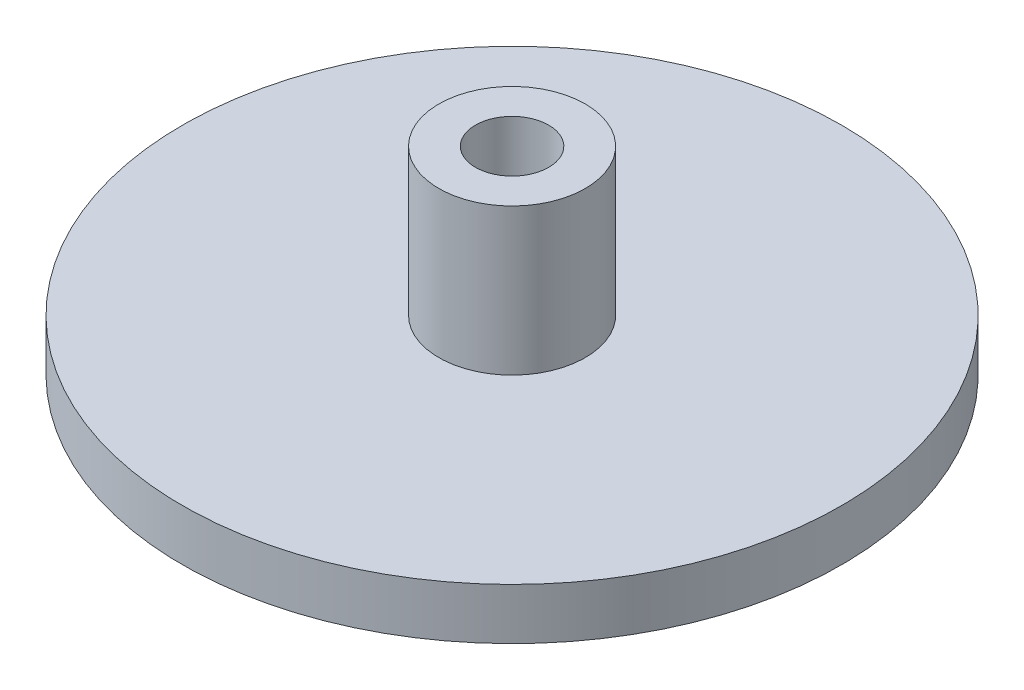
ISO-10303-21;
HEADER;
FILE_DESCRIPTION(('STEP AP214'),'2;1');
FILE_NAME('part.step','',(''),(''),'','','');
FILE_SCHEMA(('AUTOMOTIVE_DESIGN { 1 0 10303 214 1 1 1 1 }'));
ENDSEC;
DATA;
#1=APPLICATION_CONTEXT('core data for automotive mechanical design processes');
#2=APPLICATION_PROTOCOL_DEFINITION('international standard','automotive_design',2000,#1);
#3=PRODUCT_CONTEXT('',#1,'mechanical');
#4=PRODUCT('Part','Part','',(#3));
#5=PRODUCT_RELATED_PRODUCT_CATEGORY('part','',(#4));
#6=PRODUCT_DEFINITION_FORMATION('','',#4);
#7=PRODUCT_DEFINITION_CONTEXT('part definition',#1,'design');
#8=PRODUCT_DEFINITION('design','',#6,#7);
#9=PRODUCT_DEFINITION_SHAPE('','',#8);
#10=(LENGTH_UNIT() NAMED_UNIT(*) SI_UNIT(.MILLI.,.METRE.));
#11=(NAMED_UNIT(*) PLANE_ANGLE_UNIT() SI_UNIT($,.RADIAN.));
#12=(NAMED_UNIT(*) SI_UNIT($,.STERADIAN.) SOLID_ANGLE_UNIT());
#13=UNCERTAINTY_MEASURE_WITH_UNIT(LENGTH_MEASURE(1.E-05),#10,'distance_accuracy_value','');
#14=(GEOMETRIC_REPRESENTATION_CONTEXT(3) GLOBAL_UNCERTAINTY_ASSIGNED_CONTEXT((#13)) GLOBAL_UNIT_ASSIGNED_CONTEXT((#10,
#11,#12)) REPRESENTATION_CONTEXT('',''));
#15=CARTESIAN_POINT('',(0.,0.,0.));
#16=DIRECTION('',(0.,0.,1.));
#17=DIRECTION('',(1.,0.,0.));
#18=AXIS2_PLACEMENT_3D('',#15,#16,#17);
#19=CARTESIAN_POINT('',(9.,0.,0.));
#20=DIRECTION('',(0.,-1.,0.));
#21=DIRECTION('',(0.,0.,-1.));
#22=AXIS2_PLACEMENT_3D('',#19,#20,#21);
#23=PLANE('',#22);
#24=CARTESIAN_POINT('',(0.,0.,0.));
#25=DIRECTION('',(0.,-1.,0.));
#26=DIRECTION('',(0.,0.,-1.));
#27=AXIS2_PLACEMENT_3D('',#24,#25,#26);
#28=CIRCLE('',#27,9.);
#29=CARTESIAN_POINT('',(0.,0.,-9.));
#30=VERTEX_POINT('',#29);
#31=EDGE_CURVE('E53',#30,#30,#28,.T.);
#32=ORIENTED_EDGE('',*,*,#31,.T.);
#33=EDGE_LOOP('',(#32));
#34=FACE_BOUND('',#33,.T.);
#35=CARTESIAN_POINT('',(0.,0.,0.));
#36=DIRECTION('',(0.,-1.,0.));
#37=DIRECTION('',(0.,0.,-1.));
#38=AXIS2_PLACEMENT_3D('',#35,#36,#37);
#39=CIRCLE('',#38,1.);
#40=CARTESIAN_POINT('',(0.,0.,-1.));
#41=VERTEX_POINT('',#40);
#42=EDGE_CURVE('E10',#41,#41,#39,.T.);
#43=ORIENTED_EDGE('',*,*,#42,.F.);
#44=EDGE_LOOP('',(#43));
#45=FACE_BOUND('',#44,.T.);
#46=ADVANCED_FACE('F31',(#34,#45),#23,.T.);
#47=CARTESIAN_POINT('',(0.,0.,0.));
#48=DIRECTION('',(0.,-1.,0.));
#49=DIRECTION('',(0.,0.,-1.));
#50=AXIS2_PLACEMENT_3D('',#47,#48,#49);
#51=CYLINDRICAL_SURFACE('',#50,1.);
#52=ORIENTED_EDGE('',*,*,#42,.T.);
#53=EDGE_LOOP('',(#52));
#54=FACE_BOUND('',#53,.T.);
#55=CARTESIAN_POINT('',(0.,5.4,0.));
#56=DIRECTION('',(0.,-1.,0.));
#57=DIRECTION('',(0.,0.,-1.));
#58=AXIS2_PLACEMENT_3D('',#55,#56,#57);
#59=CIRCLE('',#58,1.);
#60=CARTESIAN_POINT('',(0.,5.4,-1.));
#61=VERTEX_POINT('',#60);
#62=EDGE_CURVE('E37',#61,#61,#59,.T.);
#63=ORIENTED_EDGE('',*,*,#62,.F.);
#64=EDGE_LOOP('',(#63));
#65=FACE_BOUND('',#64,.T.);
#66=ADVANCED_FACE('F71',(#54,#65),#51,.F.);
#67=CARTESIAN_POINT('',(1.,5.4,0.));
#68=DIRECTION('',(0.,1.,0.));
#69=DIRECTION('',(0.,0.,1.));
#70=AXIS2_PLACEMENT_3D('',#67,#68,#69);
#71=PLANE('',#70);
#72=ORIENTED_EDGE('',*,*,#62,.T.);
#73=EDGE_LOOP('',(#72));
#74=FACE_BOUND('',#73,.T.);
#75=CARTESIAN_POINT('',(0.,5.4,0.));
#76=DIRECTION('',(0.,-1.,0.));
#77=DIRECTION('',(0.,0.,-1.));
#78=AXIS2_PLACEMENT_3D('',#75,#76,#77);
#79=CIRCLE('',#78,2.);
#80=CARTESIAN_POINT('',(0.,5.4,-2.));
#81=VERTEX_POINT('',#80);
#82=EDGE_CURVE('E41',#81,#81,#79,.T.);
#83=ORIENTED_EDGE('',*,*,#82,.F.);
#84=EDGE_LOOP('',(#83));
#85=FACE_BOUND('',#84,.T.);
#86=ADVANCED_FACE('F75',(#74,#85),#71,.T.);
#87=CARTESIAN_POINT('',(0.,0.,0.));
#88=DIRECTION('',(0.,-1.,0.));
#89=DIRECTION('',(0.,0.,-1.));
#90=AXIS2_PLACEMENT_3D('',#87,#88,#89);
#91=CYLINDRICAL_SURFACE('',#90,2.);
#92=ORIENTED_EDGE('',*,*,#82,.T.);
#93=EDGE_LOOP('',(#92));
#94=FACE_BOUND('',#93,.T.);
#95=CARTESIAN_POINT('',(0.,1.4,0.));
#96=DIRECTION('',(0.,-1.,0.));
#97=DIRECTION('',(0.,0.,-1.));
#98=AXIS2_PLACEMENT_3D('',#95,#96,#97);
#99=CIRCLE('',#98,2.);
#100=CARTESIAN_POINT('',(0.,1.4,-2.));
#101=VERTEX_POINT('',#100);
#102=EDGE_CURVE('E45',#101,#101,#99,.T.);
#103=ORIENTED_EDGE('',*,*,#102,.F.);
#104=EDGE_LOOP('',(#103));
#105=FACE_BOUND('',#104,.T.);
#106=ADVANCED_FACE('F67',(#94,#105),#91,.T.);
#107=CARTESIAN_POINT('',(2.,1.4,0.));
#108=DIRECTION('',(0.,1.,0.));
#109=DIRECTION('',(0.,0.,1.));
#110=AXIS2_PLACEMENT_3D('',#107,#108,#109);
#111=PLANE('',#110);
#112=ORIENTED_EDGE('',*,*,#102,.T.);
#113=EDGE_LOOP('',(#112));
#114=FACE_BOUND('',#113,.T.);
#115=CARTESIAN_POINT('',(0.,1.4,0.));
#116=DIRECTION('',(0.,-1.,0.));
#117=DIRECTION('',(0.,0.,-1.));
#118=AXIS2_PLACEMENT_3D('',#115,#116,#117);
#119=CIRCLE('',#118,9.);
#120=CARTESIAN_POINT('',(0.,1.4,-9.));
#121=VERTEX_POINT('',#120);
#122=EDGE_CURVE('E50',#121,#121,#119,.T.);
#123=ORIENTED_EDGE('',*,*,#122,.F.);
#124=EDGE_LOOP('',(#123));
#125=FACE_BOUND('',#124,.T.);
#126=ADVANCED_FACE('F61',(#114,#125),#111,.T.);
#127=CARTESIAN_POINT('',(0.,0.,0.));
#128=DIRECTION('',(0.,-1.,0.));
#129=DIRECTION('',(0.,0.,-1.));
#130=AXIS2_PLACEMENT_3D('',#127,#128,#129);
#131=CYLINDRICAL_SURFACE('',#130,9.);
#132=ORIENTED_EDGE('',*,*,#122,.T.);
#133=EDGE_LOOP('',(#132));
#134=FACE_BOUND('',#133,.T.);
#135=ORIENTED_EDGE('',*,*,#31,.F.);
#136=EDGE_LOOP('',(#135));
#137=FACE_BOUND('',#136,.T.);
#138=ADVANCED_FACE('F59',(#134,#137),#131,.T.);
#139=CLOSED_SHELL('',(#46,#66,#86,#106,#126,#138));
#140=MANIFOLD_SOLID_BREP('B2',#139);
#141=ADVANCED_BREP_SHAPE_REPRESENTATION('',(#18,#140),#14);
#142=SHAPE_DEFINITION_REPRESENTATION(#9,#141);
ENDSEC;
END-ISO-10303-21;
